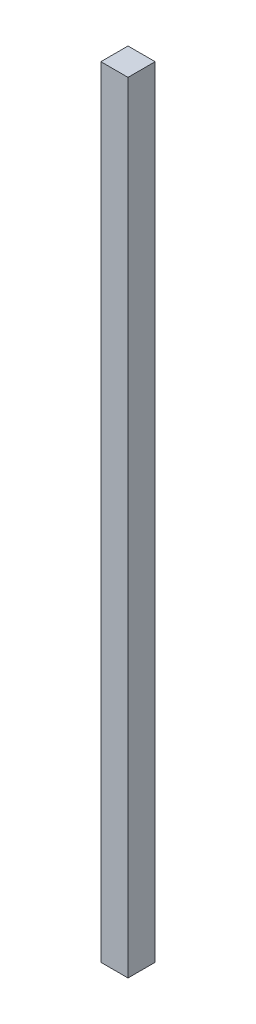
ISO-10303-21;
HEADER;
FILE_DESCRIPTION(('STEP AP214'),'2;1');
FILE_NAME('part.step','',(''),(''),'','','');
FILE_SCHEMA(('AUTOMOTIVE_DESIGN { 1 0 10303 214 1 1 1 1 }'));
ENDSEC;
DATA;
#1=APPLICATION_CONTEXT('core data for automotive mechanical design processes');
#2=APPLICATION_PROTOCOL_DEFINITION('international standard','automotive_design',2000,#1);
#3=PRODUCT_CONTEXT('',#1,'mechanical');
#4=PRODUCT('Part','Part','',(#3));
#5=PRODUCT_RELATED_PRODUCT_CATEGORY('part','',(#4));
#6=PRODUCT_DEFINITION_FORMATION('','',#4);
#7=PRODUCT_DEFINITION_CONTEXT('part definition',#1,'design');
#8=PRODUCT_DEFINITION('design','',#6,#7);
#9=PRODUCT_DEFINITION_SHAPE('','',#8);
#10=(LENGTH_UNIT() NAMED_UNIT(*) SI_UNIT(.MILLI.,.METRE.));
#11=(NAMED_UNIT(*) PLANE_ANGLE_UNIT() SI_UNIT($,.RADIAN.));
#12=(NAMED_UNIT(*) SI_UNIT($,.STERADIAN.) SOLID_ANGLE_UNIT());
#13=UNCERTAINTY_MEASURE_WITH_UNIT(LENGTH_MEASURE(1.E-05),#10,'distance_accuracy_value','');
#14=(GEOMETRIC_REPRESENTATION_CONTEXT(3) GLOBAL_UNCERTAINTY_ASSIGNED_CONTEXT((#13)) GLOBAL_UNIT_ASSIGNED_CONTEXT((#10,
#11,#12)) REPRESENTATION_CONTEXT('',''));
#15=CARTESIAN_POINT('',(0.,0.,0.));
#16=DIRECTION('',(0.,0.,1.));
#17=DIRECTION('',(1.,0.,0.));
#18=AXIS2_PLACEMENT_3D('',#15,#16,#17);
#19=CARTESIAN_POINT('',(-10.,574.6,-10.));
#20=DIRECTION('',(1.,0.,0.));
#21=DIRECTION('',(0.,0.,-1.));
#22=AXIS2_PLACEMENT_3D('',#19,#20,#21);
#23=PLANE('',#22);
#24=DIRECTION('',(0.,0.,1.));
#25=VECTOR('',#24,1.);
#26=CARTESIAN_POINT('',(-10.,0.,-10.));
#27=LINE('',#26,#25);
#28=CARTESIAN_POINT('',(-10.,0.,-10.));
#29=VERTEX_POINT('',#28);
#30=CARTESIAN_POINT('',(-10.,0.,10.));
#31=VERTEX_POINT('',#30);
#32=EDGE_CURVE('E96',#29,#31,#27,.T.);
#33=ORIENTED_EDGE('',*,*,#32,.T.);
#34=DIRECTION('',(0.,-1.,0.));
#35=VECTOR('',#34,1.);
#36=CARTESIAN_POINT('',(-10.,574.6,10.));
#37=LINE('',#36,#35);
#38=CARTESIAN_POINT('',(-10.,574.6,10.));
#39=VERTEX_POINT('',#38);
#40=EDGE_CURVE('E11',#39,#31,#37,.T.);
#41=ORIENTED_EDGE('',*,*,#40,.F.);
#42=DIRECTION('',(0.,0.,1.));
#43=VECTOR('',#42,1.);
#44=CARTESIAN_POINT('',(-10.,574.6,-10.));
#45=LINE('',#44,#43);
#46=CARTESIAN_POINT('',(-10.,574.6,-10.));
#47=VERTEX_POINT('',#46);
#48=EDGE_CURVE('E84',#47,#39,#45,.T.);
#49=ORIENTED_EDGE('',*,*,#48,.F.);
#50=DIRECTION('',(0.,-1.,0.));
#51=VECTOR('',#50,1.);
#52=CARTESIAN_POINT('',(-10.,574.6,-10.));
#53=LINE('',#52,#51);
#54=EDGE_CURVE('E92',#47,#29,#53,.T.);
#55=ORIENTED_EDGE('',*,*,#54,.T.);
#56=EDGE_LOOP('',(#33,#41,#49,#55));
#57=FACE_BOUND('',#56,.T.);
#58=ADVANCED_FACE('F33',(#57),#23,.F.);
#59=CARTESIAN_POINT('',(10.,574.6,10.));
#60=DIRECTION('',(0.,0.,-1.));
#61=DIRECTION('',(-1.,0.,0.));
#62=AXIS2_PLACEMENT_3D('',#59,#60,#61);
#63=PLANE('',#62);
#64=DIRECTION('',(1.,0.,0.));
#65=VECTOR('',#64,1.);
#66=CARTESIAN_POINT('',(10.,0.,10.));
#67=LINE('',#66,#65);
#68=CARTESIAN_POINT('',(10.,0.,10.));
#69=VERTEX_POINT('',#68);
#70=EDGE_CURVE('E88',#31,#69,#67,.T.);
#71=ORIENTED_EDGE('',*,*,#70,.T.);
#72=DIRECTION('',(0.,-1.,0.));
#73=VECTOR('',#72,1.);
#74=CARTESIAN_POINT('',(10.,574.6,10.));
#75=LINE('',#74,#73);
#76=CARTESIAN_POINT('',(10.,574.6,10.));
#77=VERTEX_POINT('',#76);
#78=EDGE_CURVE('E41',#77,#69,#75,.T.);
#79=ORIENTED_EDGE('',*,*,#78,.F.);
#80=DIRECTION('',(1.,0.,0.));
#81=VECTOR('',#80,1.);
#82=CARTESIAN_POINT('',(10.,574.6,10.));
#83=LINE('',#82,#81);
#84=EDGE_CURVE('E79',#39,#77,#83,.T.);
#85=ORIENTED_EDGE('',*,*,#84,.F.);
#86=ORIENTED_EDGE('',*,*,#40,.T.);
#87=EDGE_LOOP('',(#71,#79,#85,#86));
#88=FACE_BOUND('',#87,.T.);
#89=ADVANCED_FACE('F87',(#88),#63,.F.);
#90=CARTESIAN_POINT('',(10.,574.6,-10.));
#91=DIRECTION('',(-1.,0.,0.));
#92=DIRECTION('',(0.,0.,1.));
#93=AXIS2_PLACEMENT_3D('',#90,#91,#92);
#94=PLANE('',#93);
#95=DIRECTION('',(0.,0.,-1.));
#96=VECTOR('',#95,1.);
#97=CARTESIAN_POINT('',(10.,0.,-10.));
#98=LINE('',#97,#96);
#99=CARTESIAN_POINT('',(10.,0.,-10.));
#100=VERTEX_POINT('',#99);
#101=EDGE_CURVE('E66',#69,#100,#98,.T.);
#102=ORIENTED_EDGE('',*,*,#101,.T.);
#103=DIRECTION('',(0.,-1.,0.));
#104=VECTOR('',#103,1.);
#105=CARTESIAN_POINT('',(10.,574.6,-10.));
#106=LINE('',#105,#104);
#107=CARTESIAN_POINT('',(10.,574.6,-10.));
#108=VERTEX_POINT('',#107);
#109=EDGE_CURVE('E89',#108,#100,#106,.T.);
#110=ORIENTED_EDGE('',*,*,#109,.F.);
#111=DIRECTION('',(0.,0.,-1.));
#112=VECTOR('',#111,1.);
#113=CARTESIAN_POINT('',(10.,574.6,-10.));
#114=LINE('',#113,#112);
#115=EDGE_CURVE('E82',#77,#108,#114,.T.);
#116=ORIENTED_EDGE('',*,*,#115,.F.);
#117=ORIENTED_EDGE('',*,*,#78,.T.);
#118=EDGE_LOOP('',(#102,#110,#116,#117));
#119=FACE_BOUND('',#118,.T.);
#120=ADVANCED_FACE('F90',(#119),#94,.F.);
#121=CARTESIAN_POINT('',(10.,574.6,-10.));
#122=DIRECTION('',(0.,0.,1.));
#123=DIRECTION('',(1.,0.,0.));
#124=AXIS2_PLACEMENT_3D('',#121,#122,#123);
#125=PLANE('',#124);
#126=DIRECTION('',(-1.,0.,0.));
#127=VECTOR('',#126,1.);
#128=CARTESIAN_POINT('',(10.,0.,-10.));
#129=LINE('',#128,#127);
#130=EDGE_CURVE('E72',#100,#29,#129,.T.);
#131=ORIENTED_EDGE('',*,*,#130,.T.);
#132=ORIENTED_EDGE('',*,*,#54,.F.);
#133=DIRECTION('',(-1.,0.,0.));
#134=VECTOR('',#133,1.);
#135=CARTESIAN_POINT('',(10.,574.6,-10.));
#136=LINE('',#135,#134);
#137=EDGE_CURVE('E49',#108,#47,#136,.T.);
#138=ORIENTED_EDGE('',*,*,#137,.F.);
#139=ORIENTED_EDGE('',*,*,#109,.T.);
#140=EDGE_LOOP('',(#131,#132,#138,#139));
#141=FACE_BOUND('',#140,.T.);
#142=ADVANCED_FACE('F103',(#141),#125,.F.);
#143=CARTESIAN_POINT('',(0.,574.6,0.));
#144=DIRECTION('',(0.,-1.,0.));
#145=DIRECTION('',(0.,0.,-1.));
#146=AXIS2_PLACEMENT_3D('',#143,#144,#145);
#147=PLANE('',#146);
#148=ORIENTED_EDGE('',*,*,#48,.T.);
#149=ORIENTED_EDGE('',*,*,#84,.T.);
#150=ORIENTED_EDGE('',*,*,#115,.T.);
#151=ORIENTED_EDGE('',*,*,#137,.T.);
#152=EDGE_LOOP('',(#148,#149,#150,#151));
#153=FACE_BOUND('',#152,.T.);
#154=ADVANCED_FACE('F80',(#153),#147,.F.);
#155=CARTESIAN_POINT('',(0.,0.,0.));
#156=DIRECTION('',(0.,-1.,0.));
#157=DIRECTION('',(0.,0.,-1.));
#158=AXIS2_PLACEMENT_3D('',#155,#156,#157);
#159=PLANE('',#158);
#160=ORIENTED_EDGE('',*,*,#32,.F.);
#161=ORIENTED_EDGE('',*,*,#130,.F.);
#162=ORIENTED_EDGE('',*,*,#101,.F.);
#163=ORIENTED_EDGE('',*,*,#70,.F.);
#164=EDGE_LOOP('',(#160,#161,#162,#163));
#165=FACE_BOUND('',#164,.T.);
#166=ADVANCED_FACE('F106',(#165),#159,.T.);
#167=CLOSED_SHELL('',(#58,#89,#120,#142,#154,#166));
#168=MANIFOLD_SOLID_BREP('B2',#167);
#169=ADVANCED_BREP_SHAPE_REPRESENTATION('',(#18,#168),#14);
#170=SHAPE_DEFINITION_REPRESENTATION(#9,#169);
ENDSEC;
END-ISO-10303-21;
